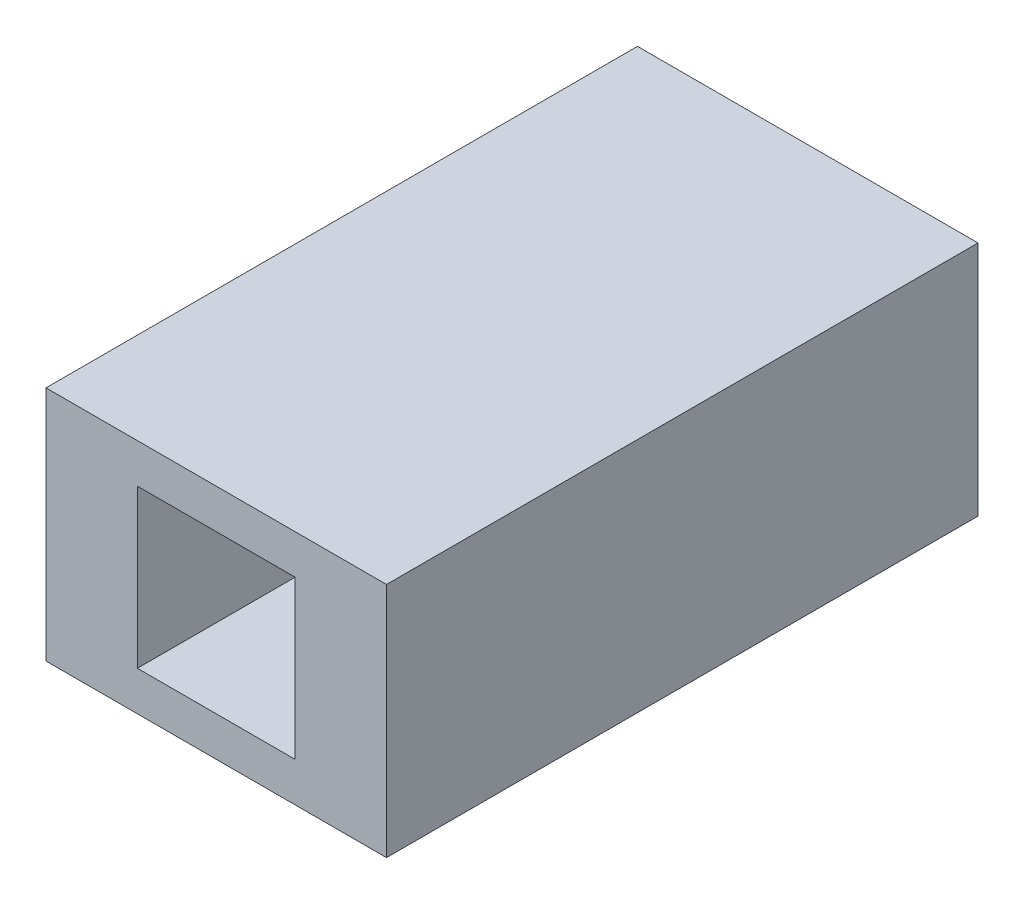
ISO-10303-21;
HEADER;
FILE_DESCRIPTION(('STEP AP214'),'2;1');
FILE_NAME('part.step','',(''),(''),'','','');
FILE_SCHEMA(('AUTOMOTIVE_DESIGN { 1 0 10303 214 1 1 1 1 }'));
ENDSEC;
DATA;
#1=APPLICATION_CONTEXT('core data for automotive mechanical design processes');
#2=APPLICATION_PROTOCOL_DEFINITION('international standard','automotive_design',2000,#1);
#3=PRODUCT_CONTEXT('',#1,'mechanical');
#4=PRODUCT('Part','Part','',(#3));
#5=PRODUCT_RELATED_PRODUCT_CATEGORY('part','',(#4));
#6=PRODUCT_DEFINITION_FORMATION('','',#4);
#7=PRODUCT_DEFINITION_CONTEXT('part definition',#1,'design');
#8=PRODUCT_DEFINITION('design','',#6,#7);
#9=PRODUCT_DEFINITION_SHAPE('','',#8);
#10=(LENGTH_UNIT() NAMED_UNIT(*) SI_UNIT(.MILLI.,.METRE.));
#11=(NAMED_UNIT(*) PLANE_ANGLE_UNIT() SI_UNIT($,.RADIAN.));
#12=(NAMED_UNIT(*) SI_UNIT($,.STERADIAN.) SOLID_ANGLE_UNIT());
#13=UNCERTAINTY_MEASURE_WITH_UNIT(LENGTH_MEASURE(1.E-05),#10,'distance_accuracy_value','');
#14=(GEOMETRIC_REPRESENTATION_CONTEXT(3) GLOBAL_UNCERTAINTY_ASSIGNED_CONTEXT((#13)) GLOBAL_UNIT_ASSIGNED_CONTEXT((#10,
#11,#12)) REPRESENTATION_CONTEXT('',''));
#15=CARTESIAN_POINT('',(0.,0.,0.));
#16=DIRECTION('',(0.,0.,1.));
#17=DIRECTION('',(1.,0.,0.));
#18=AXIS2_PLACEMENT_3D('',#15,#16,#17);
#19=CARTESIAN_POINT('',(0.,0.,150.));
#20=DIRECTION('',(0.,0.,-1.));
#21=DIRECTION('',(-1.,0.,0.));
#22=AXIS2_PLACEMENT_3D('',#19,#20,#21);
#23=PLANE('',#22);
#24=DIRECTION('',(0.,1.,0.));
#25=VECTOR('',#24,1.);
#26=CARTESIAN_POINT('',(43.174999999999,-30.,150.));
#27=LINE('',#26,#25);
#28=CARTESIAN_POINT('',(43.174999999999,-30.,150.));
#29=VERTEX_POINT('',#28);
#30=CARTESIAN_POINT('',(43.174999999999,30.,150.));
#31=VERTEX_POINT('',#30);
#32=EDGE_CURVE('E143',#29,#31,#27,.T.);
#33=ORIENTED_EDGE('',*,*,#32,.T.);
#34=DIRECTION('',(-1.,0.,0.));
#35=VECTOR('',#34,1.);
#36=CARTESIAN_POINT('',(-43.174999999999,30.,150.));
#37=LINE('',#36,#35);
#38=CARTESIAN_POINT('',(-43.174999999999,30.,150.));
#39=VERTEX_POINT('',#38);
#40=EDGE_CURVE('E91',#31,#39,#37,.T.);
#41=ORIENTED_EDGE('',*,*,#40,.T.);
#42=DIRECTION('',(0.,-1.,0.));
#43=VECTOR('',#42,1.);
#44=CARTESIAN_POINT('',(-43.174999999999,-30.,150.));
#45=LINE('',#44,#43);
#46=CARTESIAN_POINT('',(-43.174999999999,-30.,150.));
#47=VERTEX_POINT('',#46);
#48=EDGE_CURVE('E146',#39,#47,#45,.T.);
#49=ORIENTED_EDGE('',*,*,#48,.T.);
#50=DIRECTION('',(1.,0.,0.));
#51=VECTOR('',#50,1.);
#52=CARTESIAN_POINT('',(-43.174999999999,-30.,150.));
#53=LINE('',#52,#51);
#54=EDGE_CURVE('E63',#47,#29,#53,.T.);
#55=ORIENTED_EDGE('',*,*,#54,.T.);
#56=EDGE_LOOP('',(#33,#41,#49,#55));
#57=FACE_BOUND('',#56,.T.);
#58=DIRECTION('',(0.,1.,0.));
#59=VECTOR('',#58,1.);
#60=CARTESIAN_POINT('',(-20.,-20.,150.));
#61=LINE('',#60,#59);
#62=CARTESIAN_POINT('',(-20.,-20.,150.));
#63=VERTEX_POINT('',#62);
#64=CARTESIAN_POINT('',(-20.,20.,150.));
#65=VERTEX_POINT('',#64);
#66=EDGE_CURVE('E54',#63,#65,#61,.T.);
#67=ORIENTED_EDGE('',*,*,#66,.T.);
#68=DIRECTION('',(1.,0.,0.));
#69=VECTOR('',#68,1.);
#70=CARTESIAN_POINT('',(20.,20.,150.));
#71=LINE('',#70,#69);
#72=CARTESIAN_POINT('',(20.,20.,150.));
#73=VERTEX_POINT('',#72);
#74=EDGE_CURVE('E132',#65,#73,#71,.T.);
#75=ORIENTED_EDGE('',*,*,#74,.T.);
#76=DIRECTION('',(0.,-1.,0.));
#77=VECTOR('',#76,1.);
#78=CARTESIAN_POINT('',(20.,-20.,150.));
#79=LINE('',#78,#77);
#80=CARTESIAN_POINT('',(20.,-20.,150.));
#81=VERTEX_POINT('',#80);
#82=EDGE_CURVE('E265',#73,#81,#79,.T.);
#83=ORIENTED_EDGE('',*,*,#82,.T.);
#84=DIRECTION('',(-1.,0.,0.));
#85=VECTOR('',#84,1.);
#86=CARTESIAN_POINT('',(20.,-20.,150.));
#87=LINE('',#86,#85);
#88=EDGE_CURVE('E128',#81,#63,#87,.T.);
#89=ORIENTED_EDGE('',*,*,#88,.T.);
#90=EDGE_LOOP('',(#67,#75,#83,#89));
#91=FACE_BOUND('',#90,.T.);
#92=ADVANCED_FACE('F39',(#57,#91),#23,.F.);
#93=CARTESIAN_POINT('',(43.174999999999,-30.,150.));
#94=DIRECTION('',(-1.,0.,0.));
#95=DIRECTION('',(0.,0.,1.));
#96=AXIS2_PLACEMENT_3D('',#93,#94,#95);
#97=PLANE('',#96);
#98=DIRECTION('',(0.,1.,0.));
#99=VECTOR('',#98,1.);
#100=CARTESIAN_POINT('',(43.174999999999,-30.,0.));
#101=LINE('',#100,#99);
#102=CARTESIAN_POINT('',(43.174999999999,-30.,0.));
#103=VERTEX_POINT('',#102);
#104=CARTESIAN_POINT('',(43.174999999999,30.,0.));
#105=VERTEX_POINT('',#104);
#106=EDGE_CURVE('E133',#103,#105,#101,.T.);
#107=ORIENTED_EDGE('',*,*,#106,.T.);
#108=DIRECTION('',(0.,0.,-1.));
#109=VECTOR('',#108,1.);
#110=CARTESIAN_POINT('',(43.174999999999,30.,150.));
#111=LINE('',#110,#109);
#112=EDGE_CURVE('E11',#31,#105,#111,.T.);
#113=ORIENTED_EDGE('',*,*,#112,.F.);
#114=ORIENTED_EDGE('',*,*,#32,.F.);
#115=DIRECTION('',(0.,0.,-1.));
#116=VECTOR('',#115,1.);
#117=CARTESIAN_POINT('',(43.174999999999,-30.,150.));
#118=LINE('',#117,#116);
#119=EDGE_CURVE('E148',#29,#103,#118,.T.);
#120=ORIENTED_EDGE('',*,*,#119,.T.);
#121=EDGE_LOOP('',(#107,#113,#114,#120));
#122=FACE_BOUND('',#121,.T.);
#123=ADVANCED_FACE('F41',(#122),#97,.F.);
#124=CARTESIAN_POINT('',(-43.174999999999,30.,150.));
#125=DIRECTION('',(0.,-1.,0.));
#126=DIRECTION('',(0.,0.,-1.));
#127=AXIS2_PLACEMENT_3D('',#124,#125,#126);
#128=PLANE('',#127);
#129=DIRECTION('',(-1.,0.,0.));
#130=VECTOR('',#129,1.);
#131=CARTESIAN_POINT('',(-43.174999999999,30.,0.));
#132=LINE('',#131,#130);
#133=CARTESIAN_POINT('',(-43.174999999999,30.,0.));
#134=VERTEX_POINT('',#133);
#135=EDGE_CURVE('E137',#105,#134,#132,.T.);
#136=ORIENTED_EDGE('',*,*,#135,.T.);
#137=DIRECTION('',(0.,0.,-1.));
#138=VECTOR('',#137,1.);
#139=CARTESIAN_POINT('',(-43.174999999999,30.,150.));
#140=LINE('',#139,#138);
#141=EDGE_CURVE('E47',#39,#134,#140,.T.);
#142=ORIENTED_EDGE('',*,*,#141,.F.);
#143=ORIENTED_EDGE('',*,*,#40,.F.);
#144=ORIENTED_EDGE('',*,*,#112,.T.);
#145=EDGE_LOOP('',(#136,#142,#143,#144));
#146=FACE_BOUND('',#145,.T.);
#147=ADVANCED_FACE('F176',(#146),#128,.F.);
#148=CARTESIAN_POINT('',(-43.174999999999,-30.,150.));
#149=DIRECTION('',(1.,0.,0.));
#150=DIRECTION('',(0.,0.,-1.));
#151=AXIS2_PLACEMENT_3D('',#148,#149,#150);
#152=PLANE('',#151);
#153=DIRECTION('',(0.,-1.,0.));
#154=VECTOR('',#153,1.);
#155=CARTESIAN_POINT('',(-43.174999999999,-30.,0.));
#156=LINE('',#155,#154);
#157=CARTESIAN_POINT('',(-43.174999999999,-30.,0.));
#158=VERTEX_POINT('',#157);
#159=EDGE_CURVE('E151',#134,#158,#156,.T.);
#160=ORIENTED_EDGE('',*,*,#159,.T.);
#161=DIRECTION('',(0.,0.,-1.));
#162=VECTOR('',#161,1.);
#163=CARTESIAN_POINT('',(-43.174999999999,-30.,150.));
#164=LINE('',#163,#162);
#165=EDGE_CURVE('E155',#47,#158,#164,.T.);
#166=ORIENTED_EDGE('',*,*,#165,.F.);
#167=ORIENTED_EDGE('',*,*,#48,.F.);
#168=ORIENTED_EDGE('',*,*,#141,.T.);
#169=EDGE_LOOP('',(#160,#166,#167,#168));
#170=FACE_BOUND('',#169,.T.);
#171=ADVANCED_FACE('F160',(#170),#152,.F.);
#172=CARTESIAN_POINT('',(-43.174999999999,-30.,150.));
#173=DIRECTION('',(0.,1.,0.));
#174=DIRECTION('',(0.,0.,1.));
#175=AXIS2_PLACEMENT_3D('',#172,#173,#174);
#176=PLANE('',#175);
#177=DIRECTION('',(1.,0.,0.));
#178=VECTOR('',#177,1.);
#179=CARTESIAN_POINT('',(-43.174999999999,-30.,0.));
#180=LINE('',#179,#178);
#181=EDGE_CURVE('E84',#158,#103,#180,.T.);
#182=ORIENTED_EDGE('',*,*,#181,.T.);
#183=ORIENTED_EDGE('',*,*,#119,.F.);
#184=ORIENTED_EDGE('',*,*,#54,.F.);
#185=ORIENTED_EDGE('',*,*,#165,.T.);
#186=EDGE_LOOP('',(#182,#183,#184,#185));
#187=FACE_BOUND('',#186,.T.);
#188=ADVANCED_FACE('F168',(#187),#176,.F.);
#189=CARTESIAN_POINT('',(0.,0.,0.));
#190=DIRECTION('',(0.,0.,-1.));
#191=DIRECTION('',(-1.,0.,0.));
#192=AXIS2_PLACEMENT_3D('',#189,#190,#191);
#193=PLANE('',#192);
#194=ORIENTED_EDGE('',*,*,#106,.F.);
#195=ORIENTED_EDGE('',*,*,#181,.F.);
#196=ORIENTED_EDGE('',*,*,#159,.F.);
#197=ORIENTED_EDGE('',*,*,#135,.F.);
#198=EDGE_LOOP('',(#194,#195,#196,#197));
#199=FACE_BOUND('',#198,.T.);
#200=ADVANCED_FACE('F164',(#199),#193,.T.);
#201=CARTESIAN_POINT('',(-20.,-20.,5.));
#202=DIRECTION('',(1.,0.,0.));
#203=DIRECTION('',(0.,0.,-1.));
#204=AXIS2_PLACEMENT_3D('',#201,#202,#203);
#205=PLANE('',#204);
#206=ORIENTED_EDGE('',*,*,#66,.F.);
#207=DIRECTION('',(0.,0.,1.));
#208=VECTOR('',#207,1.);
#209=CARTESIAN_POINT('',(-20.,-20.,5.));
#210=LINE('',#209,#208);
#211=CARTESIAN_POINT('',(-20.,-20.,5.));
#212=VERTEX_POINT('',#211);
#213=EDGE_CURVE('E127',#212,#63,#210,.T.);
#214=ORIENTED_EDGE('',*,*,#213,.F.);
#215=DIRECTION('',(0.,1.,0.));
#216=VECTOR('',#215,1.);
#217=CARTESIAN_POINT('',(-20.,-20.,5.));
#218=LINE('',#217,#216);
#219=CARTESIAN_POINT('',(-20.,20.,5.));
#220=VERTEX_POINT('',#219);
#221=EDGE_CURVE('E119',#212,#220,#218,.T.);
#222=ORIENTED_EDGE('',*,*,#221,.T.);
#223=DIRECTION('',(0.,0.,1.));
#224=VECTOR('',#223,1.);
#225=CARTESIAN_POINT('',(-20.,20.,5.));
#226=LINE('',#225,#224);
#227=EDGE_CURVE('E126',#220,#65,#226,.T.);
#228=ORIENTED_EDGE('',*,*,#227,.T.);
#229=EDGE_LOOP('',(#206,#214,#222,#228));
#230=FACE_BOUND('',#229,.T.);
#231=ADVANCED_FACE('F125',(#230),#205,.T.);
#232=CARTESIAN_POINT('',(20.,20.,5.));
#233=DIRECTION('',(0.,-1.,0.));
#234=DIRECTION('',(0.,0.,-1.));
#235=AXIS2_PLACEMENT_3D('',#232,#233,#234);
#236=PLANE('',#235);
#237=ORIENTED_EDGE('',*,*,#74,.F.);
#238=ORIENTED_EDGE('',*,*,#227,.F.);
#239=DIRECTION('',(1.,0.,0.));
#240=VECTOR('',#239,1.);
#241=CARTESIAN_POINT('',(20.,20.,5.));
#242=LINE('',#241,#240);
#243=CARTESIAN_POINT('',(20.,20.,5.));
#244=VERTEX_POINT('',#243);
#245=EDGE_CURVE('E115',#220,#244,#242,.T.);
#246=ORIENTED_EDGE('',*,*,#245,.T.);
#247=DIRECTION('',(0.,0.,1.));
#248=VECTOR('',#247,1.);
#249=CARTESIAN_POINT('',(20.,20.,5.));
#250=LINE('',#249,#248);
#251=EDGE_CURVE('E134',#244,#73,#250,.T.);
#252=ORIENTED_EDGE('',*,*,#251,.T.);
#253=EDGE_LOOP('',(#237,#238,#246,#252));
#254=FACE_BOUND('',#253,.T.);
#255=ADVANCED_FACE('F130',(#254),#236,.T.);
#256=CARTESIAN_POINT('',(20.,-20.,5.));
#257=DIRECTION('',(-1.,0.,0.));
#258=DIRECTION('',(0.,0.,1.));
#259=AXIS2_PLACEMENT_3D('',#256,#257,#258);
#260=PLANE('',#259);
#261=ORIENTED_EDGE('',*,*,#82,.F.);
#262=ORIENTED_EDGE('',*,*,#251,.F.);
#263=DIRECTION('',(0.,-1.,0.));
#264=VECTOR('',#263,1.);
#265=CARTESIAN_POINT('',(20.,-20.,5.));
#266=LINE('',#265,#264);
#267=CARTESIAN_POINT('',(20.,-20.,5.));
#268=VERTEX_POINT('',#267);
#269=EDGE_CURVE('E120',#244,#268,#266,.T.);
#270=ORIENTED_EDGE('',*,*,#269,.T.);
#271=DIRECTION('',(0.,0.,1.));
#272=VECTOR('',#271,1.);
#273=CARTESIAN_POINT('',(20.,-20.,5.));
#274=LINE('',#273,#272);
#275=EDGE_CURVE('E139',#268,#81,#274,.T.);
#276=ORIENTED_EDGE('',*,*,#275,.T.);
#277=EDGE_LOOP('',(#261,#262,#270,#276));
#278=FACE_BOUND('',#277,.T.);
#279=ADVANCED_FACE('F189',(#278),#260,.T.);
#280=CARTESIAN_POINT('',(20.,-20.,5.));
#281=DIRECTION('',(0.,1.,0.));
#282=DIRECTION('',(0.,0.,1.));
#283=AXIS2_PLACEMENT_3D('',#280,#281,#282);
#284=PLANE('',#283);
#285=ORIENTED_EDGE('',*,*,#88,.F.);
#286=ORIENTED_EDGE('',*,*,#275,.F.);
#287=DIRECTION('',(-1.,0.,0.));
#288=VECTOR('',#287,1.);
#289=CARTESIAN_POINT('',(20.,-20.,5.));
#290=LINE('',#289,#288);
#291=EDGE_CURVE('E272',#268,#212,#290,.T.);
#292=ORIENTED_EDGE('',*,*,#291,.T.);
#293=ORIENTED_EDGE('',*,*,#213,.T.);
#294=EDGE_LOOP('',(#285,#286,#292,#293));
#295=FACE_BOUND('',#294,.T.);
#296=ADVANCED_FACE('F192',(#295),#284,.T.);
#297=CARTESIAN_POINT('',(0.,0.,5.));
#298=DIRECTION('',(0.,0.,1.));
#299=DIRECTION('',(1.,0.,0.));
#300=AXIS2_PLACEMENT_3D('',#297,#298,#299);
#301=PLANE('',#300);
#302=ORIENTED_EDGE('',*,*,#221,.F.);
#303=ORIENTED_EDGE('',*,*,#291,.F.);
#304=ORIENTED_EDGE('',*,*,#269,.F.);
#305=ORIENTED_EDGE('',*,*,#245,.F.);
#306=EDGE_LOOP('',(#302,#303,#304,#305));
#307=FACE_BOUND('',#306,.T.);
#308=ADVANCED_FACE('F117',(#307),#301,.T.);
#309=CLOSED_SHELL('',(#92,#123,#147,#171,#188,#200,#231,#255,#279,#296,#308));
#310=MANIFOLD_SOLID_BREP('B2',#309);
#311=ADVANCED_BREP_SHAPE_REPRESENTATION('',(#18,#310),#14);
#312=SHAPE_DEFINITION_REPRESENTATION(#9,#311);
ENDSEC;
END-ISO-10303-21;
